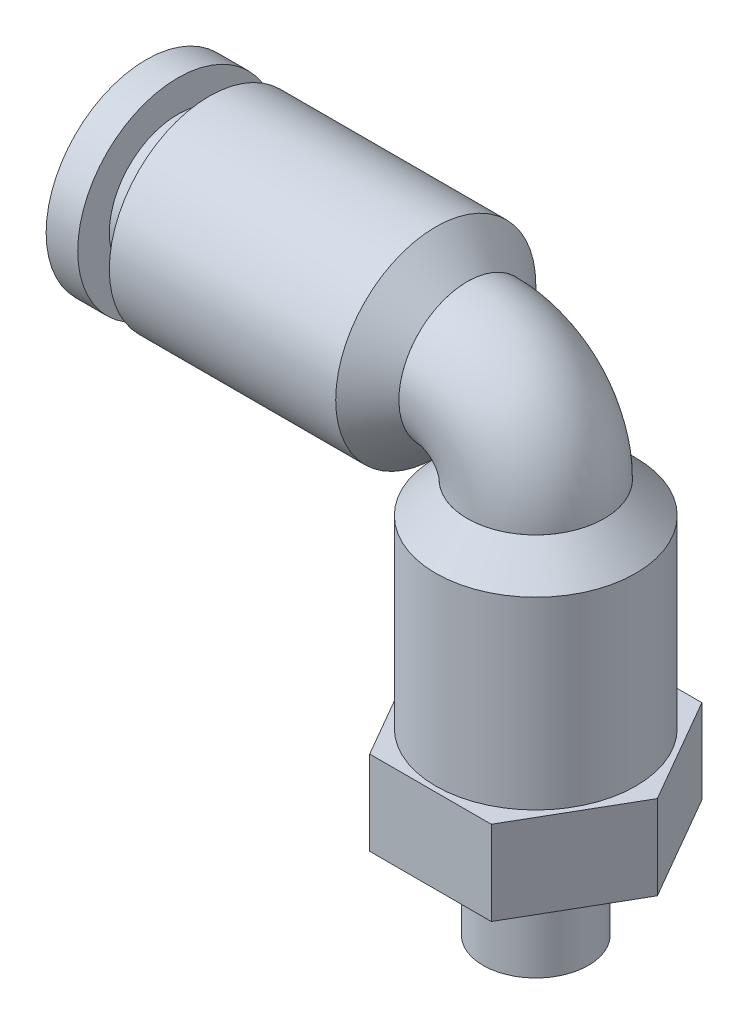
ISO-10303-21;
HEADER;
FILE_DESCRIPTION(('STEP AP214'),'2;1');
FILE_NAME('part.step','',(''),(''),'','','');
FILE_SCHEMA(('AUTOMOTIVE_DESIGN { 1 0 10303 214 1 1 1 1 }'));
ENDSEC;
DATA;
#1=APPLICATION_CONTEXT('core data for automotive mechanical design processes');
#2=APPLICATION_PROTOCOL_DEFINITION('international standard','automotive_design',2000,#1);
#3=PRODUCT_CONTEXT('',#1,'mechanical');
#4=PRODUCT('Part','Part','',(#3));
#5=PRODUCT_RELATED_PRODUCT_CATEGORY('part','',(#4));
#6=PRODUCT_DEFINITION_FORMATION('','',#4);
#7=PRODUCT_DEFINITION_CONTEXT('part definition',#1,'design');
#8=PRODUCT_DEFINITION('design','',#6,#7);
#9=PRODUCT_DEFINITION_SHAPE('','',#8);
#10=(LENGTH_UNIT() NAMED_UNIT(*) SI_UNIT(.MILLI.,.METRE.));
#11=(NAMED_UNIT(*) PLANE_ANGLE_UNIT() SI_UNIT($,.RADIAN.));
#12=(NAMED_UNIT(*) SI_UNIT($,.STERADIAN.) SOLID_ANGLE_UNIT());
#13=UNCERTAINTY_MEASURE_WITH_UNIT(LENGTH_MEASURE(1.E-05),#10,'distance_accuracy_value','');
#14=(GEOMETRIC_REPRESENTATION_CONTEXT(3) GLOBAL_UNCERTAINTY_ASSIGNED_CONTEXT((#13)) GLOBAL_UNIT_ASSIGNED_CONTEXT((#10,
#11,#12)) REPRESENTATION_CONTEXT('',''));
#15=CARTESIAN_POINT('',(0.,0.,0.));
#16=DIRECTION('',(0.,0.,1.));
#17=DIRECTION('',(1.,0.,0.));
#18=AXIS2_PLACEMENT_3D('',#15,#16,#17);
#19=CARTESIAN_POINT('',(0.,-3.25000000000001,0.));
#20=DIRECTION('',(0.,-1.,0.));
#21=DIRECTION('',(0.,0.,-1.));
#22=AXIS2_PLACEMENT_3D('',#19,#20,#21);
#23=PLANE('',#22);
#24=CARTESIAN_POINT('',(0.,-3.25000000000001,0.));
#25=DIRECTION('',(0.,-1.,0.));
#26=DIRECTION('',(0.,0.,-1.));
#27=AXIS2_PLACEMENT_3D('',#24,#25,#26);
#28=CIRCLE('',#27,3.249);
#29=CARTESIAN_POINT('',(3.249,-3.25000000000002,0.));
#30=VERTEX_POINT('',#29);
#31=EDGE_CURVE('P0_E10',#30,#30,#28,.T.);
#32=ORIENTED_EDGE('',*,*,#31,.T.);
#33=EDGE_LOOP('',(#32));
#34=FACE_BOUND('',#33,.T.);
#35=CARTESIAN_POINT('',(0.,-3.25000000000001,0.));
#36=DIRECTION('',(0.,-1.,0.));
#37=DIRECTION('',(1.,0.,0.));
#38=AXIS2_PLACEMENT_3D('',#35,#36,#37);
#39=CIRCLE('',#38,1.5);
#40=CARTESIAN_POINT('',(1.5,-3.25000000000002,0.));
#41=VERTEX_POINT('',#40);
#42=EDGE_CURVE('P0_E18',#41,#41,#39,.F.);
#43=ORIENTED_EDGE('',*,*,#42,.T.);
#44=EDGE_LOOP('',(#43));
#45=FACE_BOUND('',#44,.T.);
#46=ADVANCED_FACE('P0_F14',(#34,#45),#23,.T.);
#47=CARTESIAN_POINT('',(-3.25,-3.25,0.));
#48=DIRECTION('',(0.,0.,1.));
#49=DIRECTION('',(1.,0.,0.));
#50=AXIS2_PLACEMENT_3D('',#47,#48,#49);
#51=TOROIDAL_SURFACE('',#50,3.25,3.249);
#52=CARTESIAN_POINT('',(-3.25,0.,0.));
#53=DIRECTION('',(1.,0.,0.));
#54=DIRECTION('',(0.,0.,-1.));
#55=AXIS2_PLACEMENT_3D('',#52,#53,#54);
#56=CIRCLE('',#55,3.249);
#57=CARTESIAN_POINT('',(-3.25,3.249,0.));
#58=VERTEX_POINT('',#57);
#59=EDGE_CURVE('P0_E22',#58,#58,#56,.T.);
#60=CARTESIAN_POINT('',(-3.25,-3.25,0.));
#61=DIRECTION('',(0.,0.,1.));
#62=DIRECTION('',(1.,0.,0.));
#63=AXIS2_PLACEMENT_3D('',#60,#61,#62);
#64=CIRCLE('',#63,6.499);
#65=EDGE_CURVE('',#30,#58,#64,.T.);
#66=ORIENTED_EDGE('',*,*,#31,.F.);
#67=ORIENTED_EDGE('',*,*,#59,.T.);
#68=ORIENTED_EDGE('',*,*,#65,.T.);
#69=ORIENTED_EDGE('',*,*,#65,.F.);
#70=EDGE_LOOP('',(#66,#68,#67,#69));
#71=FACE_BOUND('',#70,.T.);
#72=ADVANCED_FACE('P0_F16',(#71),#51,.T.);
#73=CARTESIAN_POINT('',(-3.25,0.,0.));
#74=DIRECTION('',(1.,0.,0.));
#75=DIRECTION('',(0.,0.,-1.));
#76=AXIS2_PLACEMENT_3D('',#73,#74,#75);
#77=PLANE('',#76);
#78=CARTESIAN_POINT('',(-3.25,0.,0.));
#79=DIRECTION('',(1.,0.,0.));
#80=DIRECTION('',(0.,0.,-1.));
#81=AXIS2_PLACEMENT_3D('',#78,#79,#80);
#82=CIRCLE('',#81,1.5);
#83=CARTESIAN_POINT('',(-3.25,0.,-1.5));
#84=VERTEX_POINT('',#83);
#85=EDGE_CURVE('P0_E29',#84,#84,#82,.T.);
#86=ORIENTED_EDGE('',*,*,#85,.T.);
#87=EDGE_LOOP('',(#86));
#88=FACE_BOUND('',#87,.T.);
#89=ORIENTED_EDGE('',*,*,#59,.F.);
#90=EDGE_LOOP('',(#89));
#91=FACE_BOUND('',#90,.T.);
#92=ADVANCED_FACE('P0_F50',(#88,#91),#77,.F.);
#93=CARTESIAN_POINT('',(-3.,0.,0.));
#94=DIRECTION('',(-1.,0.,0.));
#95=DIRECTION('',(0.,0.,1.));
#96=AXIS2_PLACEMENT_3D('',#93,#94,#95);
#97=CYLINDRICAL_SURFACE('',#96,1.5);
#98=CARTESIAN_POINT('',(-3.,0.,0.));
#99=DIRECTION('',(-1.,0.,0.));
#100=DIRECTION('',(0.,0.,1.));
#101=AXIS2_PLACEMENT_3D('',#98,#99,#100);
#102=CIRCLE('',#101,1.5);
#103=CARTESIAN_POINT('',(-3.,1.5,0.));
#104=VERTEX_POINT('',#103);
#105=EDGE_CURVE('P0_E36',#104,#104,#102,.T.);
#106=ORIENTED_EDGE('',*,*,#105,.F.);
#107=EDGE_LOOP('',(#106));
#108=FACE_BOUND('',#107,.T.);
#109=ORIENTED_EDGE('',*,*,#85,.F.);
#110=EDGE_LOOP('',(#109));
#111=FACE_BOUND('',#110,.T.);
#112=ADVANCED_FACE('P0_F46',(#108,#111),#97,.F.);
#113=CARTESIAN_POINT('',(0.,-3.,0.));
#114=DIRECTION('',(0.,-1.,0.));
#115=DIRECTION('',(1.,0.,0.));
#116=AXIS2_PLACEMENT_3D('',#113,#114,#115);
#117=CYLINDRICAL_SURFACE('',#116,1.5);
#118=ORIENTED_EDGE('',*,*,#42,.F.);
#119=EDGE_LOOP('',(#118));
#120=FACE_BOUND('',#119,.T.);
#121=CARTESIAN_POINT('',(0.,-3.,0.));
#122=DIRECTION('',(0.,1.,0.));
#123=DIRECTION('',(0.,0.,1.));
#124=AXIS2_PLACEMENT_3D('',#121,#122,#123);
#125=CIRCLE('',#124,1.5);
#126=CARTESIAN_POINT('',(1.5,-3.,0.));
#127=VERTEX_POINT('',#126);
#128=EDGE_CURVE('P0_E31',#127,#127,#125,.T.);
#129=ORIENTED_EDGE('',*,*,#128,.T.);
#130=EDGE_LOOP('',(#129));
#131=FACE_BOUND('',#130,.T.);
#132=ADVANCED_FACE('P0_F49',(#120,#131),#117,.F.);
#133=CARTESIAN_POINT('',(-3.,-3.,0.));
#134=DIRECTION('',(0.,0.,-1.));
#135=DIRECTION('',(-1.,0.,0.));
#136=AXIS2_PLACEMENT_3D('',#133,#134,#135);
#137=TOROIDAL_SURFACE('',#136,3.,1.5);
#138=CARTESIAN_POINT('',(-3.,-3.,0.));
#139=DIRECTION('',(0.,0.,-1.));
#140=DIRECTION('',(-1.,0.,0.));
#141=AXIS2_PLACEMENT_3D('',#138,#139,#140);
#142=CIRCLE('',#141,4.5);
#143=EDGE_CURVE('',#104,#127,#142,.T.);
#144=ORIENTED_EDGE('',*,*,#105,.T.);
#145=ORIENTED_EDGE('',*,*,#128,.F.);
#146=ORIENTED_EDGE('',*,*,#143,.T.);
#147=ORIENTED_EDGE('',*,*,#143,.F.);
#148=EDGE_LOOP('',(#144,#146,#145,#147));
#149=FACE_BOUND('',#148,.T.);
#150=ADVANCED_FACE('P0_F43',(#149),#137,.F.);
#151=CLOSED_SHELL('',(#46,#72,#92,#112,#132,#150));
#152=MANIFOLD_SOLID_BREP('P0_B1',#151);
#153=CARTESIAN_POINT('',(-7.,-17.5,0.));
#154=DIRECTION('',(0.,-1.,0.));
#155=DIRECTION('',(0.,0.,-1.));
#156=AXIS2_PLACEMENT_3D('',#153,#154,#155);
#157=PLANE('',#156);
#158=CARTESIAN_POINT('',(0.,-17.5,0.));
#159=DIRECTION('',(0.,1.,0.));
#160=DIRECTION('',(0.,0.,1.));
#161=AXIS2_PLACEMENT_3D('',#158,#159,#160);
#162=CIRCLE('',#161,2.5);
#163=CARTESIAN_POINT('',(0.,-17.5,2.5));
#164=VERTEX_POINT('',#163);
#165=EDGE_CURVE('P1_E25',#164,#164,#162,.T.);
#166=ORIENTED_EDGE('',*,*,#165,.T.);
#167=EDGE_LOOP('',(#166));
#168=FACE_BOUND('',#167,.T.);
#169=DIRECTION('',(1.,0.,0.));
#170=VECTOR('',#169,1.);
#171=CARTESIAN_POINT('',(-2.88675134594813,-17.5,-5.));
#172=LINE('',#171,#170);
#173=CARTESIAN_POINT('',(-2.88675134594813,-17.5,-5.));
#174=VERTEX_POINT('',#173);
#175=CARTESIAN_POINT('',(2.88675134594813,-17.5,-5.));
#176=VERTEX_POINT('',#175);
#177=EDGE_CURVE('P1_E106',#174,#176,#172,.T.);
#178=ORIENTED_EDGE('',*,*,#177,.T.);
#179=DIRECTION('',(0.5,0.,0.866025403784439));
#180=VECTOR('',#179,1.);
#181=CARTESIAN_POINT('',(2.88675134594813,-17.5,-5.));
#182=LINE('',#181,#180);
#183=CARTESIAN_POINT('',(5.77350269189625,-17.5,0.));
#184=VERTEX_POINT('',#183);
#185=EDGE_CURVE('P1_E72',#176,#184,#182,.T.);
#186=ORIENTED_EDGE('',*,*,#185,.T.);
#187=DIRECTION('',(-0.5,0.,0.866025403784439));
#188=VECTOR('',#187,1.);
#189=CARTESIAN_POINT('',(5.77350269189625,-17.5,0.));
#190=LINE('',#189,#188);
#191=CARTESIAN_POINT('',(2.88675134594812,-17.5,5.));
#192=VERTEX_POINT('',#191);
#193=EDGE_CURVE('P1_E84',#184,#192,#190,.T.);
#194=ORIENTED_EDGE('',*,*,#193,.T.);
#195=DIRECTION('',(-1.,0.,0.));
#196=VECTOR('',#195,1.);
#197=CARTESIAN_POINT('',(2.88675134594812,-17.5,5.));
#198=LINE('',#197,#196);
#199=CARTESIAN_POINT('',(-2.88675134594813,-17.5,5.));
#200=VERTEX_POINT('',#199);
#201=EDGE_CURVE('P1_E32',#192,#200,#198,.T.);
#202=ORIENTED_EDGE('',*,*,#201,.T.);
#203=DIRECTION('',(-0.5,0.,-0.866025403784439));
#204=VECTOR('',#203,1.);
#205=CARTESIAN_POINT('',(-2.88675134594813,-17.5,5.));
#206=LINE('',#205,#204);
#207=CARTESIAN_POINT('',(-5.77350269189626,-17.5,0.));
#208=VERTEX_POINT('',#207);
#209=EDGE_CURVE('P1_E112',#200,#208,#206,.T.);
#210=ORIENTED_EDGE('',*,*,#209,.T.);
#211=DIRECTION('',(0.5,0.,-0.866025403784439));
#212=VECTOR('',#211,1.);
#213=CARTESIAN_POINT('',(-5.77350269189626,-17.5,0.));
#214=LINE('',#213,#212);
#215=EDGE_CURVE('P1_E109',#208,#174,#214,.T.);
#216=ORIENTED_EDGE('',*,*,#215,.T.);
#217=EDGE_LOOP('',(#178,#186,#194,#202,#210,#216));
#218=FACE_BOUND('',#217,.T.);
#219=ADVANCED_FACE('P1_F16',(#168,#218),#157,.T.);
#220=CARTESIAN_POINT('',(-4.74999999999999,-13.5,0.));
#221=DIRECTION('',(0.,1.,0.));
#222=DIRECTION('',(0.,0.,1.));
#223=AXIS2_PLACEMENT_3D('',#220,#221,#222);
#224=PLANE('',#223);
#225=CARTESIAN_POINT('',(0.,-13.5,0.));
#226=DIRECTION('',(0.,1.,0.));
#227=DIRECTION('',(0.,0.,1.));
#228=AXIS2_PLACEMENT_3D('',#225,#226,#227);
#229=CIRCLE('',#228,4.74999999999999);
#230=CARTESIAN_POINT('',(0.,-13.5,4.74999999999999));
#231=VERTEX_POINT('',#230);
#232=EDGE_CURVE('P1_E125',#231,#231,#229,.T.);
#233=ORIENTED_EDGE('',*,*,#232,.F.);
#234=EDGE_LOOP('',(#233));
#235=FACE_BOUND('',#234,.T.);
#236=DIRECTION('',(-0.5,0.,0.866025403784439));
#237=VECTOR('',#236,1.);
#238=CARTESIAN_POINT('',(5.77350269189625,-13.5,0.));
#239=LINE('',#238,#237);
#240=CARTESIAN_POINT('',(5.77350269189625,-13.5,0.));
#241=VERTEX_POINT('',#240);
#242=CARTESIAN_POINT('',(2.88675134594812,-13.5,5.));
#243=VERTEX_POINT('',#242);
#244=EDGE_CURVE('P1_E90',#241,#243,#239,.T.);
#245=ORIENTED_EDGE('',*,*,#244,.F.);
#246=DIRECTION('',(0.5,0.,0.866025403784439));
#247=VECTOR('',#246,1.);
#248=CARTESIAN_POINT('',(2.88675134594813,-13.5,-5.));
#249=LINE('',#248,#247);
#250=CARTESIAN_POINT('',(2.88675134594813,-13.5,-5.));
#251=VERTEX_POINT('',#250);
#252=EDGE_CURVE('P1_E40',#251,#241,#249,.T.);
#253=ORIENTED_EDGE('',*,*,#252,.F.);
#254=DIRECTION('',(1.,0.,0.));
#255=VECTOR('',#254,1.);
#256=CARTESIAN_POINT('',(-2.88675134594813,-13.5,-5.));
#257=LINE('',#256,#255);
#258=CARTESIAN_POINT('',(-2.88675134594813,-13.5,-5.));
#259=VERTEX_POINT('',#258);
#260=EDGE_CURVE('P1_E78',#259,#251,#257,.T.);
#261=ORIENTED_EDGE('',*,*,#260,.F.);
#262=DIRECTION('',(0.5,0.,-0.866025403784439));
#263=VECTOR('',#262,1.);
#264=CARTESIAN_POINT('',(-5.77350269189626,-13.5,0.));
#265=LINE('',#264,#263);
#266=CARTESIAN_POINT('',(-5.77350269189626,-13.5,0.));
#267=VERTEX_POINT('',#266);
#268=EDGE_CURVE('P1_E97',#267,#259,#265,.T.);
#269=ORIENTED_EDGE('',*,*,#268,.F.);
#270=DIRECTION('',(-0.5,0.,-0.866025403784439));
#271=VECTOR('',#270,1.);
#272=CARTESIAN_POINT('',(-2.88675134594813,-13.5,5.));
#273=LINE('',#272,#271);
#274=CARTESIAN_POINT('',(-2.88675134594813,-13.5,5.));
#275=VERTEX_POINT('',#274);
#276=EDGE_CURVE('P1_E100',#275,#267,#273,.T.);
#277=ORIENTED_EDGE('',*,*,#276,.F.);
#278=DIRECTION('',(-1.,0.,0.));
#279=VECTOR('',#278,1.);
#280=CARTESIAN_POINT('',(2.88675134594812,-13.5,5.));
#281=LINE('',#280,#279);
#282=EDGE_CURVE('P1_E92',#243,#275,#281,.T.);
#283=ORIENTED_EDGE('',*,*,#282,.F.);
#284=EDGE_LOOP('',(#245,#253,#261,#269,#277,#283));
#285=FACE_BOUND('',#284,.T.);
#286=ADVANCED_FACE('P1_F87',(#235,#285),#224,.T.);
#287=CARTESIAN_POINT('',(-2.5,-22.,0.));
#288=DIRECTION('',(0.,-1.,0.));
#289=DIRECTION('',(0.,0.,-1.));
#290=AXIS2_PLACEMENT_3D('',#287,#288,#289);
#291=PLANE('',#290);
#292=CARTESIAN_POINT('',(0.,-22.,0.));
#293=DIRECTION('',(0.,1.,0.));
#294=DIRECTION('',(0.,0.,1.));
#295=AXIS2_PLACEMENT_3D('',#292,#293,#294);
#296=CIRCLE('',#295,2.5);
#297=CARTESIAN_POINT('',(0.,-22.,2.5));
#298=VERTEX_POINT('',#297);
#299=EDGE_CURVE('P1_E11',#298,#298,#296,.T.);
#300=ORIENTED_EDGE('',*,*,#299,.F.);
#301=EDGE_LOOP('',(#300));
#302=FACE_BOUND('',#301,.T.);
#303=CARTESIAN_POINT('',(0.,-22.,0.));
#304=DIRECTION('',(0.,1.,0.));
#305=DIRECTION('',(0.,0.,1.));
#306=AXIS2_PLACEMENT_3D('',#303,#304,#305);
#307=CIRCLE('',#306,1.5);
#308=CARTESIAN_POINT('',(0.,-22.,1.5));
#309=VERTEX_POINT('',#308);
#310=EDGE_CURVE('P1_E99',#309,#309,#307,.T.);
#311=ORIENTED_EDGE('',*,*,#310,.T.);
#312=EDGE_LOOP('',(#311));
#313=FACE_BOUND('',#312,.T.);
#314=ADVANCED_FACE('P1_F18',(#302,#313),#291,.T.);
#315=CARTESIAN_POINT('',(0.,-3.25,0.));
#316=DIRECTION('',(0.,1.,0.));
#317=DIRECTION('',(0.,0.,1.));
#318=AXIS2_PLACEMENT_3D('',#315,#316,#317);
#319=PLANE('',#318);
#320=CARTESIAN_POINT('',(0.,-3.25,0.));
#321=DIRECTION('',(0.,1.,0.));
#322=DIRECTION('',(0.,0.,1.));
#323=AXIS2_PLACEMENT_3D('',#320,#321,#322);
#324=CIRCLE('',#323,3.25);
#325=CARTESIAN_POINT('',(0.,-3.25,3.25));
#326=VERTEX_POINT('',#325);
#327=EDGE_CURVE('P1_E119',#326,#326,#324,.T.);
#328=ORIENTED_EDGE('',*,*,#327,.T.);
#329=EDGE_LOOP('',(#328));
#330=FACE_BOUND('',#329,.T.);
#331=CARTESIAN_POINT('',(0.,-3.25,0.));
#332=DIRECTION('',(0.,1.,0.));
#333=DIRECTION('',(0.,0.,1.));
#334=AXIS2_PLACEMENT_3D('',#331,#332,#333);
#335=CIRCLE('',#334,1.5);
#336=CARTESIAN_POINT('',(0.,-3.25,1.5));
#337=VERTEX_POINT('',#336);
#338=EDGE_CURVE('P1_E20',#337,#337,#335,.F.);
#339=ORIENTED_EDGE('',*,*,#338,.T.);
#340=EDGE_LOOP('',(#339));
#341=FACE_BOUND('',#340,.T.);
#342=ADVANCED_FACE('P1_F136',(#330,#341),#319,.T.);
#343=CARTESIAN_POINT('',(0.,0.,0.));
#344=DIRECTION('',(0.,1.,0.));
#345=DIRECTION('',(0.,0.,1.));
#346=AXIS2_PLACEMENT_3D('',#343,#344,#345);
#347=CYLINDRICAL_SURFACE('',#346,2.5);
#348=ORIENTED_EDGE('',*,*,#299,.T.);
#349=EDGE_LOOP('',(#348));
#350=FACE_BOUND('',#349,.T.);
#351=ORIENTED_EDGE('',*,*,#165,.F.);
#352=EDGE_LOOP('',(#351));
#353=FACE_BOUND('',#352,.T.);
#354=ADVANCED_FACE('P1_F133',(#350,#353),#347,.T.);
#355=CARTESIAN_POINT('',(0.,0.,0.));
#356=DIRECTION('',(0.,1.,0.));
#357=DIRECTION('',(0.,0.,1.));
#358=AXIS2_PLACEMENT_3D('',#355,#356,#357);
#359=CYLINDRICAL_SURFACE('',#358,4.74999999999999);
#360=ORIENTED_EDGE('',*,*,#232,.T.);
#361=EDGE_LOOP('',(#360));
#362=FACE_BOUND('',#361,.T.);
#363=CARTESIAN_POINT('',(0.,-4.75,0.));
#364=DIRECTION('',(0.,1.,0.));
#365=DIRECTION('',(0.,0.,1.));
#366=AXIS2_PLACEMENT_3D('',#363,#364,#365);
#367=CIRCLE('',#366,4.74999999999999);
#368=CARTESIAN_POINT('',(0.,-4.75,4.74999999999999));
#369=VERTEX_POINT('',#368);
#370=EDGE_CURVE('P1_E122',#369,#369,#367,.T.);
#371=ORIENTED_EDGE('',*,*,#370,.F.);
#372=EDGE_LOOP('',(#371));
#373=FACE_BOUND('',#372,.T.);
#374=ADVANCED_FACE('P1_F135',(#362,#373),#359,.T.);
#375=CARTESIAN_POINT('',(0.,-3.25,0.));
#376=DIRECTION('',(0.,-1.,0.));
#377=DIRECTION('',(0.,0.,-1.));
#378=AXIS2_PLACEMENT_3D('',#375,#376,#377);
#379=CONICAL_SURFACE('',#378,3.25,0.785398163397447);
#380=ORIENTED_EDGE('',*,*,#370,.T.);
#381=EDGE_LOOP('',(#380));
#382=FACE_BOUND('',#381,.T.);
#383=ORIENTED_EDGE('',*,*,#327,.F.);
#384=EDGE_LOOP('',(#383));
#385=FACE_BOUND('',#384,.T.);
#386=ADVANCED_FACE('P1_F144',(#382,#385),#379,.T.);
#387=CARTESIAN_POINT('',(0.,-3.,0.));
#388=DIRECTION('',(0.,-1.,0.));
#389=DIRECTION('',(1.,0.,0.));
#390=AXIS2_PLACEMENT_3D('',#387,#388,#389);
#391=CYLINDRICAL_SURFACE('',#390,1.5);
#392=ORIENTED_EDGE('',*,*,#338,.F.);
#393=EDGE_LOOP('',(#392));
#394=FACE_BOUND('',#393,.T.);
#395=ORIENTED_EDGE('',*,*,#310,.F.);
#396=EDGE_LOOP('',(#395));
#397=FACE_BOUND('',#396,.T.);
#398=ADVANCED_FACE('P1_F158',(#394,#397),#391,.F.);
#399=CARTESIAN_POINT('',(2.88675134594812,15.8812801797335,-5.));
#400=DIRECTION('',(0.866025403784439,0.,-0.499999999999999));
#401=DIRECTION('',(-0.5,0.,-0.866025403784439));
#402=AXIS2_PLACEMENT_3D('',#399,#400,#401);
#403=PLANE('',#402);
#404=ORIENTED_EDGE('',*,*,#252,.T.);
#405=DIRECTION('',(0.,-1.,0.));
#406=VECTOR('',#405,1.);
#407=CARTESIAN_POINT('',(5.77350269189625,15.8812801797335,0.));
#408=LINE('',#407,#406);
#409=EDGE_CURVE('P1_E115',#241,#184,#408,.T.);
#410=ORIENTED_EDGE('',*,*,#409,.T.);
#411=ORIENTED_EDGE('',*,*,#185,.F.);
#412=DIRECTION('',(0.,-1.,0.));
#413=VECTOR('',#412,1.);
#414=CARTESIAN_POINT('',(2.88675134594812,15.8812801797335,-5.));
#415=LINE('',#414,#413);
#416=EDGE_CURVE('P1_E68',#251,#176,#415,.T.);
#417=ORIENTED_EDGE('',*,*,#416,.F.);
#418=EDGE_LOOP('',(#404,#410,#411,#417));
#419=FACE_BOUND('',#418,.T.);
#420=ADVANCED_FACE('P1_F70',(#419),#403,.T.);
#421=CARTESIAN_POINT('',(-2.88675134594813,15.8812801797335,-5.));
#422=DIRECTION('',(0.,0.,-1.));
#423=DIRECTION('',(-1.,0.,0.));
#424=AXIS2_PLACEMENT_3D('',#421,#422,#423);
#425=PLANE('',#424);
#426=ORIENTED_EDGE('',*,*,#260,.T.);
#427=ORIENTED_EDGE('',*,*,#416,.T.);
#428=ORIENTED_EDGE('',*,*,#177,.F.);
#429=DIRECTION('',(0.,-1.,0.));
#430=VECTOR('',#429,1.);
#431=CARTESIAN_POINT('',(-2.88675134594813,15.8812801797335,-5.));
#432=LINE('',#431,#430);
#433=EDGE_CURVE('P1_E80',#259,#174,#432,.T.);
#434=ORIENTED_EDGE('',*,*,#433,.F.);
#435=EDGE_LOOP('',(#426,#427,#428,#434));
#436=FACE_BOUND('',#435,.T.);
#437=ADVANCED_FACE('P1_F79',(#436),#425,.T.);
#438=CARTESIAN_POINT('',(-5.77350269189626,15.8812801797335,0.));
#439=DIRECTION('',(-0.866025403784438,0.,-0.5));
#440=DIRECTION('',(-0.5,0.,0.866025403784439));
#441=AXIS2_PLACEMENT_3D('',#438,#439,#440);
#442=PLANE('',#441);
#443=ORIENTED_EDGE('',*,*,#268,.T.);
#444=ORIENTED_EDGE('',*,*,#433,.T.);
#445=ORIENTED_EDGE('',*,*,#215,.F.);
#446=DIRECTION('',(0.,-1.,0.));
#447=VECTOR('',#446,1.);
#448=CARTESIAN_POINT('',(-5.77350269189626,15.8812801797335,0.));
#449=LINE('',#448,#447);
#450=EDGE_CURVE('P1_E107',#267,#208,#449,.T.);
#451=ORIENTED_EDGE('',*,*,#450,.F.);
#452=EDGE_LOOP('',(#443,#444,#445,#451));
#453=FACE_BOUND('',#452,.T.);
#454=ADVANCED_FACE('P1_F168',(#453),#442,.T.);
#455=CARTESIAN_POINT('',(-2.88675134594814,15.8812801797335,5.));
#456=DIRECTION('',(-0.866025403784439,0.,0.5));
#457=DIRECTION('',(0.5,0.,0.866025403784439));
#458=AXIS2_PLACEMENT_3D('',#455,#456,#457);
#459=PLANE('',#458);
#460=ORIENTED_EDGE('',*,*,#276,.T.);
#461=ORIENTED_EDGE('',*,*,#450,.T.);
#462=ORIENTED_EDGE('',*,*,#209,.F.);
#463=DIRECTION('',(0.,-1.,0.));
#464=VECTOR('',#463,1.);
#465=CARTESIAN_POINT('',(-2.88675134594814,15.8812801797335,5.));
#466=LINE('',#465,#464);
#467=EDGE_CURVE('P1_E110',#275,#200,#466,.T.);
#468=ORIENTED_EDGE('',*,*,#467,.F.);
#469=EDGE_LOOP('',(#460,#461,#462,#468));
#470=FACE_BOUND('',#469,.T.);
#471=ADVANCED_FACE('P1_F171',(#470),#459,.T.);
#472=CARTESIAN_POINT('',(2.88675134594812,15.8812801797335,5.));
#473=DIRECTION('',(0.,0.,1.));
#474=DIRECTION('',(1.,0.,0.));
#475=AXIS2_PLACEMENT_3D('',#472,#473,#474);
#476=PLANE('',#475);
#477=ORIENTED_EDGE('',*,*,#282,.T.);
#478=ORIENTED_EDGE('',*,*,#467,.T.);
#479=ORIENTED_EDGE('',*,*,#201,.F.);
#480=DIRECTION('',(0.,-1.,0.));
#481=VECTOR('',#480,1.);
#482=CARTESIAN_POINT('',(2.88675134594812,15.8812801797335,5.));
#483=LINE('',#482,#481);
#484=EDGE_CURVE('P1_E113',#243,#192,#483,.T.);
#485=ORIENTED_EDGE('',*,*,#484,.F.);
#486=EDGE_LOOP('',(#477,#478,#479,#485));
#487=FACE_BOUND('',#486,.T.);
#488=ADVANCED_FACE('P1_F175',(#487),#476,.T.);
#489=CARTESIAN_POINT('',(5.77350269189625,15.8812801797335,0.));
#490=DIRECTION('',(0.866025403784439,0.,0.5));
#491=DIRECTION('',(0.5,0.,-0.866025403784439));
#492=AXIS2_PLACEMENT_3D('',#489,#490,#491);
#493=PLANE('',#492);
#494=ORIENTED_EDGE('',*,*,#244,.T.);
#495=ORIENTED_EDGE('',*,*,#484,.T.);
#496=ORIENTED_EDGE('',*,*,#193,.F.);
#497=ORIENTED_EDGE('',*,*,#409,.F.);
#498=EDGE_LOOP('',(#494,#495,#496,#497));
#499=FACE_BOUND('',#498,.T.);
#500=ADVANCED_FACE('P1_F179',(#499),#493,.T.);
#501=CLOSED_SHELL('',(#219,#286,#314,#342,#354,#374,#386,#398,#420,#437,#454,#471,#488,#500));
#502=MANIFOLD_SOLID_BREP('P1_B1',#501);
#503=CARTESIAN_POINT('',(-18.5,0.,0.));
#504=DIRECTION('',(-1.,0.,0.));
#505=DIRECTION('',(0.,0.,1.));
#506=AXIS2_PLACEMENT_3D('',#503,#504,#505);
#507=CYLINDRICAL_SURFACE('',#506,4.75);
#508=CARTESIAN_POINT('',(-17.,0.,0.));
#509=DIRECTION('',(-1.,0.,0.));
#510=DIRECTION('',(0.,0.,1.));
#511=AXIS2_PLACEMENT_3D('',#508,#509,#510);
#512=CIRCLE('',#511,4.75);
#513=CARTESIAN_POINT('',(-17.,0.,4.75));
#514=VERTEX_POINT('',#513);
#515=EDGE_CURVE('P2_E10',#514,#514,#512,.T.);
#516=ORIENTED_EDGE('',*,*,#515,.T.);
#517=EDGE_LOOP('',(#516));
#518=FACE_BOUND('',#517,.T.);
#519=CARTESIAN_POINT('',(-18.5,0.,0.));
#520=DIRECTION('',(-1.,0.,0.));
#521=DIRECTION('',(0.,0.,1.));
#522=AXIS2_PLACEMENT_3D('',#519,#520,#521);
#523=CIRCLE('',#522,4.75);
#524=CARTESIAN_POINT('',(-18.5,0.,4.75));
#525=VERTEX_POINT('',#524);
#526=EDGE_CURVE('P2_E39',#525,#525,#523,.T.);
#527=ORIENTED_EDGE('',*,*,#526,.F.);
#528=EDGE_LOOP('',(#527));
#529=FACE_BOUND('',#528,.T.);
#530=ADVANCED_FACE('P2_F14',(#518,#529),#507,.T.);
#531=CARTESIAN_POINT('',(-17.,-4.75,0.));
#532=DIRECTION('',(1.,0.,0.));
#533=DIRECTION('',(0.,0.,-1.));
#534=AXIS2_PLACEMENT_3D('',#531,#532,#533);
#535=PLANE('',#534);
#536=CARTESIAN_POINT('',(-17.,0.,0.));
#537=DIRECTION('',(-1.,0.,0.));
#538=DIRECTION('',(0.,0.,1.));
#539=AXIS2_PLACEMENT_3D('',#536,#537,#538);
#540=CIRCLE('',#539,3.25);
#541=CARTESIAN_POINT('',(-17.,0.,3.25));
#542=VERTEX_POINT('',#541);
#543=EDGE_CURVE('P2_E20',#542,#542,#540,.T.);
#544=ORIENTED_EDGE('',*,*,#543,.T.);
#545=EDGE_LOOP('',(#544));
#546=FACE_BOUND('',#545,.T.);
#547=ORIENTED_EDGE('',*,*,#515,.F.);
#548=EDGE_LOOP('',(#547));
#549=FACE_BOUND('',#548,.T.);
#550=ADVANCED_FACE('P2_F59',(#546,#549),#535,.T.);
#551=CARTESIAN_POINT('',(-18.5,0.,0.));
#552=DIRECTION('',(-1.,0.,0.));
#553=DIRECTION('',(0.,0.,1.));
#554=AXIS2_PLACEMENT_3D('',#551,#552,#553);
#555=CYLINDRICAL_SURFACE('',#554,3.25);
#556=CARTESIAN_POINT('',(-15.5,0.,0.));
#557=DIRECTION('',(-1.,0.,0.));
#558=DIRECTION('',(0.,0.,1.));
#559=AXIS2_PLACEMENT_3D('',#556,#557,#558);
#560=CIRCLE('',#559,3.25);
#561=CARTESIAN_POINT('',(-15.5,0.,3.25));
#562=VERTEX_POINT('',#561);
#563=EDGE_CURVE('P2_E24',#562,#562,#560,.T.);
#564=ORIENTED_EDGE('',*,*,#563,.T.);
#565=EDGE_LOOP('',(#564));
#566=FACE_BOUND('',#565,.T.);
#567=ORIENTED_EDGE('',*,*,#543,.F.);
#568=EDGE_LOOP('',(#567));
#569=FACE_BOUND('',#568,.T.);
#570=ADVANCED_FACE('P2_F64',(#566,#569),#555,.T.);
#571=CARTESIAN_POINT('',(-15.5,-3.25,0.));
#572=DIRECTION('',(-1.,0.,0.));
#573=DIRECTION('',(0.,0.,1.));
#574=AXIS2_PLACEMENT_3D('',#571,#572,#573);
#575=PLANE('',#574);
#576=CARTESIAN_POINT('',(-15.5,0.,0.));
#577=DIRECTION('',(-1.,0.,0.));
#578=DIRECTION('',(0.,0.,1.));
#579=AXIS2_PLACEMENT_3D('',#576,#577,#578);
#580=CIRCLE('',#579,4.75);
#581=CARTESIAN_POINT('',(-15.5,0.,4.75));
#582=VERTEX_POINT('',#581);
#583=EDGE_CURVE('P2_E28',#582,#582,#580,.T.);
#584=ORIENTED_EDGE('',*,*,#583,.T.);
#585=EDGE_LOOP('',(#584));
#586=FACE_BOUND('',#585,.T.);
#587=ORIENTED_EDGE('',*,*,#563,.F.);
#588=EDGE_LOOP('',(#587));
#589=FACE_BOUND('',#588,.T.);
#590=ADVANCED_FACE('P2_F68',(#586,#589),#575,.T.);
#591=CARTESIAN_POINT('',(-18.5,0.,0.));
#592=DIRECTION('',(-1.,0.,0.));
#593=DIRECTION('',(0.,0.,1.));
#594=AXIS2_PLACEMENT_3D('',#591,#592,#593);
#595=CYLINDRICAL_SURFACE('',#594,4.75);
#596=CARTESIAN_POINT('',(-4.74999999999999,0.,0.));
#597=DIRECTION('',(-1.,0.,0.));
#598=DIRECTION('',(0.,0.,1.));
#599=AXIS2_PLACEMENT_3D('',#596,#597,#598);
#600=CIRCLE('',#599,4.75);
#601=CARTESIAN_POINT('',(-4.74999999999999,0.,4.75));
#602=VERTEX_POINT('',#601);
#603=EDGE_CURVE('P2_E33',#602,#602,#600,.T.);
#604=ORIENTED_EDGE('',*,*,#603,.T.);
#605=EDGE_LOOP('',(#604));
#606=FACE_BOUND('',#605,.T.);
#607=ORIENTED_EDGE('',*,*,#583,.F.);
#608=EDGE_LOOP('',(#607));
#609=FACE_BOUND('',#608,.T.);
#610=ADVANCED_FACE('P2_F75',(#606,#609),#595,.T.);
#611=CARTESIAN_POINT('',(-4.74999999999999,0.,0.));
#612=DIRECTION('',(-1.,0.,0.));
#613=DIRECTION('',(0.,0.,1.));
#614=AXIS2_PLACEMENT_3D('',#611,#612,#613);
#615=CONICAL_SURFACE('',#614,4.75,0.78539816339745);
#616=CARTESIAN_POINT('',(-3.25,0.,0.));
#617=DIRECTION('',(-1.,0.,0.));
#618=DIRECTION('',(0.,0.,1.));
#619=AXIS2_PLACEMENT_3D('',#616,#617,#618);
#620=CIRCLE('',#619,3.25);
#621=CARTESIAN_POINT('',(-3.25,0.,3.25));
#622=VERTEX_POINT('',#621);
#623=EDGE_CURVE('P2_E36',#622,#622,#620,.T.);
#624=ORIENTED_EDGE('',*,*,#623,.T.);
#625=EDGE_LOOP('',(#624));
#626=FACE_BOUND('',#625,.T.);
#627=ORIENTED_EDGE('',*,*,#603,.F.);
#628=EDGE_LOOP('',(#627));
#629=FACE_BOUND('',#628,.T.);
#630=ADVANCED_FACE('P2_F79',(#626,#629),#615,.T.);
#631=CARTESIAN_POINT('',(-3.25,-3.25,0.));
#632=DIRECTION('',(1.,0.,0.));
#633=DIRECTION('',(0.,0.,-1.));
#634=AXIS2_PLACEMENT_3D('',#631,#632,#633);
#635=PLANE('',#634);
#636=CARTESIAN_POINT('',(-3.25,0.,0.));
#637=DIRECTION('',(1.,0.,0.));
#638=DIRECTION('',(0.,0.,-1.));
#639=AXIS2_PLACEMENT_3D('',#636,#637,#638);
#640=CIRCLE('',#639,2.);
#641=CARTESIAN_POINT('',(-3.25,0.,-2.));
#642=VERTEX_POINT('',#641);
#643=EDGE_CURVE('P2_E42',#642,#642,#640,.T.);
#644=ORIENTED_EDGE('',*,*,#643,.F.);
#645=EDGE_LOOP('',(#644));
#646=FACE_BOUND('',#645,.T.);
#647=ORIENTED_EDGE('',*,*,#623,.F.);
#648=EDGE_LOOP('',(#647));
#649=FACE_BOUND('',#648,.T.);
#650=ADVANCED_FACE('P2_F54',(#646,#649),#635,.T.);
#651=CARTESIAN_POINT('',(-18.5,0.,0.));
#652=DIRECTION('',(-1.,0.,0.));
#653=DIRECTION('',(0.,0.,1.));
#654=AXIS2_PLACEMENT_3D('',#651,#652,#653);
#655=PLANE('',#654);
#656=CARTESIAN_POINT('',(-18.5,0.,0.));
#657=DIRECTION('',(-1.,0.,0.));
#658=DIRECTION('',(0.,0.,1.));
#659=AXIS2_PLACEMENT_3D('',#656,#657,#658);
#660=CIRCLE('',#659,2.);
#661=CARTESIAN_POINT('',(-18.5,0.,2.));
#662=VERTEX_POINT('',#661);
#663=EDGE_CURVE('P2_E45',#662,#662,#660,.T.);
#664=ORIENTED_EDGE('',*,*,#663,.F.);
#665=EDGE_LOOP('',(#664));
#666=FACE_BOUND('',#665,.T.);
#667=ORIENTED_EDGE('',*,*,#526,.T.);
#668=EDGE_LOOP('',(#667));
#669=FACE_BOUND('',#668,.T.);
#670=ADVANCED_FACE('P2_F51',(#666,#669),#655,.T.);
#671=CARTESIAN_POINT('',(-1.5,0.,0.));
#672=DIRECTION('',(-1.,0.,0.));
#673=DIRECTION('',(0.,0.,1.));
#674=AXIS2_PLACEMENT_3D('',#671,#672,#673);
#675=CYLINDRICAL_SURFACE('',#674,2.);
#676=ORIENTED_EDGE('',*,*,#643,.T.);
#677=EDGE_LOOP('',(#676));
#678=FACE_BOUND('',#677,.T.);
#679=ORIENTED_EDGE('',*,*,#663,.T.);
#680=EDGE_LOOP('',(#679));
#681=FACE_BOUND('',#680,.T.);
#682=ADVANCED_FACE('P2_F49',(#678,#681),#675,.F.);
#683=CLOSED_SHELL('',(#530,#550,#570,#590,#610,#630,#650,#670,#682));
#684=MANIFOLD_SOLID_BREP('P2_B1',#683);
#685=ADVANCED_BREP_SHAPE_REPRESENTATION('',(#18,#152,#502,#684),#14);
#686=SHAPE_DEFINITION_REPRESENTATION(#9,#685);
ENDSEC;
END-ISO-10303-21;
